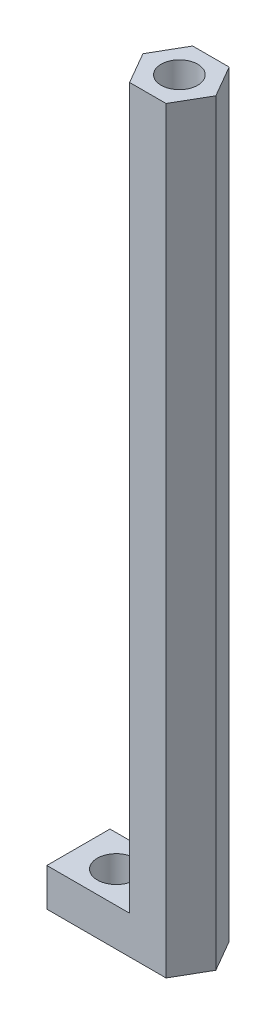
ISO-10303-21;
HEADER;
FILE_DESCRIPTION(('STEP AP214'),'2;1');
FILE_NAME('part.step','',(''),(''),'','','');
FILE_SCHEMA(('AUTOMOTIVE_DESIGN { 1 0 10303 214 1 1 1 1 }'));
ENDSEC;
DATA;
#1=APPLICATION_CONTEXT('core data for automotive mechanical design processes');
#2=APPLICATION_PROTOCOL_DEFINITION('international standard','automotive_design',2000,#1);
#3=PRODUCT_CONTEXT('',#1,'mechanical');
#4=PRODUCT('Part','Part','',(#3));
#5=PRODUCT_RELATED_PRODUCT_CATEGORY('part','',(#4));
#6=PRODUCT_DEFINITION_FORMATION('','',#4);
#7=PRODUCT_DEFINITION_CONTEXT('part definition',#1,'design');
#8=PRODUCT_DEFINITION('design','',#6,#7);
#9=PRODUCT_DEFINITION_SHAPE('','',#8);
#10=(LENGTH_UNIT() NAMED_UNIT(*) SI_UNIT(.MILLI.,.METRE.));
#11=(NAMED_UNIT(*) PLANE_ANGLE_UNIT() SI_UNIT($,.RADIAN.));
#12=(NAMED_UNIT(*) SI_UNIT($,.STERADIAN.) SOLID_ANGLE_UNIT());
#13=UNCERTAINTY_MEASURE_WITH_UNIT(LENGTH_MEASURE(1.E-05),#10,'distance_accuracy_value','');
#14=(GEOMETRIC_REPRESENTATION_CONTEXT(3) GLOBAL_UNCERTAINTY_ASSIGNED_CONTEXT((#13)) GLOBAL_UNIT_ASSIGNED_CONTEXT((#10,
#11,#12)) REPRESENTATION_CONTEXT('',''));
#15=CARTESIAN_POINT('',(0.,0.,0.));
#16=DIRECTION('',(0.,0.,1.));
#17=DIRECTION('',(1.,0.,0.));
#18=AXIS2_PLACEMENT_3D('',#15,#16,#17);
#19=CARTESIAN_POINT('',(3.55662432702594,60.,-2.5));
#20=DIRECTION('',(0.866025403784439,0.,0.5));
#21=DIRECTION('',(0.5,0.,-0.866025403784439));
#22=AXIS2_PLACEMENT_3D('',#19,#20,#21);
#23=PLANE('',#22);
#24=DIRECTION('',(0.,-1.,0.));
#25=VECTOR('',#24,1.);
#26=CARTESIAN_POINT('',(2.43649903883042,6.,-0.559886090002635));
#27=LINE('',#26,#25);
#28=CARTESIAN_POINT('',(2.43649903883042,7.00000000000002,-0.559886090002635));
#29=VERTEX_POINT('',#28);
#30=CARTESIAN_POINT('',(2.43649903883042,3.,-0.559886090002635));
#31=VERTEX_POINT('',#30);
#32=EDGE_CURVE('E111',#29,#31,#27,.T.);
#33=ORIENTED_EDGE('',*,*,#32,.F.);
#34=DIRECTION('',(-0.5,0.,0.866025403784439));
#35=VECTOR('',#34,1.);
#36=CARTESIAN_POINT('',(3.55662432702594,7.00000000000002,-2.5));
#37=LINE('',#36,#35);
#38=CARTESIAN_POINT('',(2.11324865405187,7.00000000000002,0.));
#39=VERTEX_POINT('',#38);
#40=EDGE_CURVE('E170',#29,#39,#37,.T.);
#41=ORIENTED_EDGE('',*,*,#40,.T.);
#42=DIRECTION('',(0.,-1.,0.));
#43=VECTOR('',#42,1.);
#44=CARTESIAN_POINT('',(2.11324865405187,60.,0.));
#45=LINE('',#44,#43);
#46=CARTESIAN_POINT('',(2.11324865405187,60.,0.));
#47=VERTEX_POINT('',#46);
#48=EDGE_CURVE('E176',#47,#39,#45,.T.);
#49=ORIENTED_EDGE('',*,*,#48,.F.);
#50=DIRECTION('',(-0.5,0.,0.866025403784439));
#51=VECTOR('',#50,1.);
#52=CARTESIAN_POINT('',(3.55662432702594,60.,-2.5));
#53=LINE('',#52,#51);
#54=CARTESIAN_POINT('',(3.55662432702594,60.,-2.5));
#55=VERTEX_POINT('',#54);
#56=EDGE_CURVE('E258',#55,#47,#53,.T.);
#57=ORIENTED_EDGE('',*,*,#56,.F.);
#58=DIRECTION('',(0.,-1.,0.));
#59=VECTOR('',#58,1.);
#60=CARTESIAN_POINT('',(3.55662432702594,60.,-2.5));
#61=LINE('',#60,#59);
#62=CARTESIAN_POINT('',(3.55662432702594,3.,-2.5));
#63=VERTEX_POINT('',#62);
#64=EDGE_CURVE('E181',#55,#63,#61,.T.);
#65=ORIENTED_EDGE('',*,*,#64,.T.);
#66=DIRECTION('',(0.5,0.,-0.866025403784439));
#67=VECTOR('',#66,1.);
#68=CARTESIAN_POINT('',(1.5849364905389,3.,0.915063509461097));
#69=LINE('',#68,#67);
#70=EDGE_CURVE('E132',#31,#63,#69,.T.);
#71=ORIENTED_EDGE('',*,*,#70,.F.);
#72=EDGE_LOOP('',(#33,#41,#49,#57,#65,#71));
#73=FACE_BOUND('',#72,.T.);
#74=ADVANCED_FACE('F33',(#73),#23,.F.);
#75=CARTESIAN_POINT('',(2.11324865405187,60.,0.));
#76=DIRECTION('',(0.866025403784439,0.,-0.5));
#77=DIRECTION('',(-0.5,0.,-0.866025403784439));
#78=AXIS2_PLACEMENT_3D('',#75,#76,#77);
#79=PLANE('',#78);
#80=ORIENTED_EDGE('',*,*,#48,.T.);
#81=DIRECTION('',(0.5,0.,0.866025403784439));
#82=VECTOR('',#81,1.);
#83=CARTESIAN_POINT('',(2.11324865405187,7.00000000000002,0.));
#84=LINE('',#83,#82);
#85=CARTESIAN_POINT('',(2.43649903883042,7.00000000000002,0.559886090002635));
#86=VERTEX_POINT('',#85);
#87=EDGE_CURVE('E125',#39,#86,#84,.T.);
#88=ORIENTED_EDGE('',*,*,#87,.T.);
#89=DIRECTION('',(0.,-1.,0.));
#90=VECTOR('',#89,1.);
#91=CARTESIAN_POINT('',(2.43649903883042,6.,0.559886090002635));
#92=LINE('',#91,#90);
#93=CARTESIAN_POINT('',(2.43649903883042,3.,0.559886090002635));
#94=VERTEX_POINT('',#93);
#95=EDGE_CURVE('E110',#94,#86,#92,.F.);
#96=ORIENTED_EDGE('',*,*,#95,.F.);
#97=DIRECTION('',(-0.5,0.,-0.866025403784439));
#98=VECTOR('',#97,1.);
#99=CARTESIAN_POINT('',(1.58493649053891,3.,-0.915063509461097));
#100=LINE('',#99,#98);
#101=CARTESIAN_POINT('',(3.55662432702594,3.,2.5));
#102=VERTEX_POINT('',#101);
#103=EDGE_CURVE('E122',#102,#94,#100,.T.);
#104=ORIENTED_EDGE('',*,*,#103,.F.);
#105=DIRECTION('',(0.,-1.,0.));
#106=VECTOR('',#105,1.);
#107=CARTESIAN_POINT('',(3.55662432702594,60.,2.5));
#108=LINE('',#107,#106);
#109=CARTESIAN_POINT('',(3.55662432702594,60.,2.5));
#110=VERTEX_POINT('',#109);
#111=EDGE_CURVE('E182',#110,#102,#108,.T.);
#112=ORIENTED_EDGE('',*,*,#111,.F.);
#113=DIRECTION('',(0.5,0.,0.866025403784439));
#114=VECTOR('',#113,1.);
#115=CARTESIAN_POINT('',(2.11324865405187,60.,0.));
#116=LINE('',#115,#114);
#117=EDGE_CURVE('E180',#47,#110,#116,.T.);
#118=ORIENTED_EDGE('',*,*,#117,.F.);
#119=EDGE_LOOP('',(#80,#88,#96,#104,#112,#118));
#120=FACE_BOUND('',#119,.T.);
#121=ADVANCED_FACE('F120',(#120),#79,.F.);
#122=CARTESIAN_POINT('',(0.,3.,0.));
#123=DIRECTION('',(0.,1.,0.));
#124=DIRECTION('',(0.,0.,1.));
#125=AXIS2_PLACEMENT_3D('',#122,#123,#124);
#126=PLANE('',#125);
#127=ORIENTED_EDGE('',*,*,#103,.T.);
#128=CARTESIAN_POINT('',(0.,3.,0.));
#129=DIRECTION('',(0.,1.,0.));
#130=DIRECTION('',(0.,0.,1.));
#131=AXIS2_PLACEMENT_3D('',#128,#129,#130);
#132=CIRCLE('',#131,2.5);
#133=EDGE_CURVE('E107',#94,#31,#132,.T.);
#134=ORIENTED_EDGE('',*,*,#133,.T.);
#135=ORIENTED_EDGE('',*,*,#70,.T.);
#136=DIRECTION('',(-1.,0.,0.));
#137=VECTOR('',#136,1.);
#138=CARTESIAN_POINT('',(0.,3.,-2.5));
#139=LINE('',#138,#137);
#140=CARTESIAN_POINT('',(-3.,3.,-2.5));
#141=VERTEX_POINT('',#140);
#142=EDGE_CURVE('E142',#63,#141,#139,.T.);
#143=ORIENTED_EDGE('',*,*,#142,.T.);
#144=DIRECTION('',(0.,0.,1.));
#145=VECTOR('',#144,1.);
#146=CARTESIAN_POINT('',(-3.,3.,0.));
#147=LINE('',#146,#145);
#148=CARTESIAN_POINT('',(-3.,3.,2.5));
#149=VERTEX_POINT('',#148);
#150=EDGE_CURVE('E145',#141,#149,#147,.T.);
#151=ORIENTED_EDGE('',*,*,#150,.T.);
#152=DIRECTION('',(1.,0.,0.));
#153=VECTOR('',#152,1.);
#154=CARTESIAN_POINT('',(0.,3.,2.5));
#155=LINE('',#154,#153);
#156=EDGE_CURVE('E131',#149,#102,#155,.T.);
#157=ORIENTED_EDGE('',*,*,#156,.T.);
#158=EDGE_LOOP('',(#127,#134,#135,#143,#151,#157));
#159=FACE_BOUND('',#158,.T.);
#160=CARTESIAN_POINT('',(0.,3.,0.));
#161=DIRECTION('',(0.,1.,0.));
#162=DIRECTION('',(0.,0.,1.));
#163=AXIS2_PLACEMENT_3D('',#160,#161,#162);
#164=CIRCLE('',#163,1.5);
#165=CARTESIAN_POINT('',(0.,3.,1.5));
#166=VERTEX_POINT('',#165);
#167=EDGE_CURVE('E147',#166,#166,#164,.T.);
#168=ORIENTED_EDGE('',*,*,#167,.F.);
#169=EDGE_LOOP('',(#168));
#170=FACE_BOUND('',#169,.T.);
#171=ADVANCED_FACE('F128',(#159,#170),#126,.T.);
#172=CARTESIAN_POINT('',(0.,3.,2.5));
#173=DIRECTION('',(0.,0.,-1.));
#174=DIRECTION('',(-1.,0.,0.));
#175=AXIS2_PLACEMENT_3D('',#172,#173,#174);
#176=PLANE('',#175);
#177=DIRECTION('',(1.,0.,0.));
#178=VECTOR('',#177,1.);
#179=CARTESIAN_POINT('',(0.,0.,2.5));
#180=LINE('',#179,#178);
#181=CARTESIAN_POINT('',(-3.,0.,2.5));
#182=VERTEX_POINT('',#181);
#183=CARTESIAN_POINT('',(6.44337567297407,0.,2.5));
#184=VERTEX_POINT('',#183);
#185=EDGE_CURVE('E135',#182,#184,#180,.T.);
#186=ORIENTED_EDGE('',*,*,#185,.T.);
#187=DIRECTION('',(0.,-1.,0.));
#188=VECTOR('',#187,1.);
#189=CARTESIAN_POINT('',(6.44337567297407,60.,2.5));
#190=LINE('',#189,#188);
#191=CARTESIAN_POINT('',(6.44337567297407,60.,2.5));
#192=VERTEX_POINT('',#191);
#193=EDGE_CURVE('E133',#192,#184,#190,.T.);
#194=ORIENTED_EDGE('',*,*,#193,.F.);
#195=DIRECTION('',(1.,0.,0.));
#196=VECTOR('',#195,1.);
#197=CARTESIAN_POINT('',(3.55662432702594,60.,2.5));
#198=LINE('',#197,#196);
#199=EDGE_CURVE('E246',#110,#192,#198,.T.);
#200=ORIENTED_EDGE('',*,*,#199,.F.);
#201=ORIENTED_EDGE('',*,*,#111,.T.);
#202=ORIENTED_EDGE('',*,*,#156,.F.);
#203=DIRECTION('',(0.,-1.,0.));
#204=VECTOR('',#203,1.);
#205=CARTESIAN_POINT('',(-3.,3.,2.5));
#206=LINE('',#205,#204);
#207=EDGE_CURVE('E150',#149,#182,#206,.T.);
#208=ORIENTED_EDGE('',*,*,#207,.T.);
#209=EDGE_LOOP('',(#186,#194,#200,#201,#202,#208));
#210=FACE_BOUND('',#209,.T.);
#211=ADVANCED_FACE('F212',(#210),#176,.F.);
#212=CARTESIAN_POINT('',(0.,3.,-2.5));
#213=DIRECTION('',(0.,0.,1.));
#214=DIRECTION('',(1.,0.,0.));
#215=AXIS2_PLACEMENT_3D('',#212,#213,#214);
#216=PLANE('',#215);
#217=DIRECTION('',(0.,-1.,0.));
#218=VECTOR('',#217,1.);
#219=CARTESIAN_POINT('',(6.44337567297406,60.,-2.5));
#220=LINE('',#219,#218);
#221=CARTESIAN_POINT('',(6.44337567297406,60.,-2.5));
#222=VERTEX_POINT('',#221);
#223=CARTESIAN_POINT('',(6.44337567297406,0.,-2.5));
#224=VERTEX_POINT('',#223);
#225=EDGE_CURVE('E264',#222,#224,#220,.T.);
#226=ORIENTED_EDGE('',*,*,#225,.T.);
#227=DIRECTION('',(-1.,0.,0.));
#228=VECTOR('',#227,1.);
#229=CARTESIAN_POINT('',(0.,0.,-2.5));
#230=LINE('',#229,#228);
#231=CARTESIAN_POINT('',(-3.,0.,-2.5));
#232=VERTEX_POINT('',#231);
#233=EDGE_CURVE('E153',#224,#232,#230,.T.);
#234=ORIENTED_EDGE('',*,*,#233,.T.);
#235=DIRECTION('',(0.,-1.,0.));
#236=VECTOR('',#235,1.);
#237=CARTESIAN_POINT('',(-3.,3.,-2.5));
#238=LINE('',#237,#236);
#239=EDGE_CURVE('E161',#141,#232,#238,.T.);
#240=ORIENTED_EDGE('',*,*,#239,.F.);
#241=ORIENTED_EDGE('',*,*,#142,.F.);
#242=ORIENTED_EDGE('',*,*,#64,.F.);
#243=DIRECTION('',(-1.,0.,0.));
#244=VECTOR('',#243,1.);
#245=CARTESIAN_POINT('',(6.44337567297406,60.,-2.5));
#246=LINE('',#245,#244);
#247=EDGE_CURVE('E256',#222,#55,#246,.T.);
#248=ORIENTED_EDGE('',*,*,#247,.F.);
#249=EDGE_LOOP('',(#226,#234,#240,#241,#242,#248));
#250=FACE_BOUND('',#249,.T.);
#251=ADVANCED_FACE('F223',(#250),#216,.F.);
#252=CARTESIAN_POINT('',(-3.,3.,0.));
#253=DIRECTION('',(1.,0.,0.));
#254=DIRECTION('',(0.,0.,-1.));
#255=AXIS2_PLACEMENT_3D('',#252,#253,#254);
#256=PLANE('',#255);
#257=DIRECTION('',(0.,0.,1.));
#258=VECTOR('',#257,1.);
#259=CARTESIAN_POINT('',(-3.,0.,0.));
#260=LINE('',#259,#258);
#261=EDGE_CURVE('E155',#232,#182,#260,.T.);
#262=ORIENTED_EDGE('',*,*,#261,.T.);
#263=ORIENTED_EDGE('',*,*,#207,.F.);
#264=ORIENTED_EDGE('',*,*,#150,.F.);
#265=ORIENTED_EDGE('',*,*,#239,.T.);
#266=EDGE_LOOP('',(#262,#263,#264,#265));
#267=FACE_BOUND('',#266,.T.);
#268=ADVANCED_FACE('F219',(#267),#256,.F.);
#269=CARTESIAN_POINT('',(0.,3.,0.));
#270=DIRECTION('',(0.,-1.,0.));
#271=DIRECTION('',(0.,0.,-1.));
#272=AXIS2_PLACEMENT_3D('',#269,#270,#271);
#273=CYLINDRICAL_SURFACE('',#272,1.5);
#274=ORIENTED_EDGE('',*,*,#167,.T.);
#275=EDGE_LOOP('',(#274));
#276=FACE_BOUND('',#275,.T.);
#277=CARTESIAN_POINT('',(0.,0.,0.));
#278=DIRECTION('',(0.,1.,0.));
#279=DIRECTION('',(0.,0.,1.));
#280=AXIS2_PLACEMENT_3D('',#277,#278,#279);
#281=CIRCLE('',#280,1.5);
#282=CARTESIAN_POINT('',(0.,0.,1.5));
#283=VERTEX_POINT('',#282);
#284=EDGE_CURVE('E143',#283,#283,#281,.T.);
#285=ORIENTED_EDGE('',*,*,#284,.F.);
#286=EDGE_LOOP('',(#285));
#287=FACE_BOUND('',#286,.T.);
#288=ADVANCED_FACE('F215',(#276,#287),#273,.F.);
#289=CARTESIAN_POINT('',(0.,0.,0.));
#290=DIRECTION('',(0.,1.,0.));
#291=DIRECTION('',(0.,0.,1.));
#292=AXIS2_PLACEMENT_3D('',#289,#290,#291);
#293=PLANE('',#292);
#294=ORIENTED_EDGE('',*,*,#233,.F.);
#295=DIRECTION('',(0.5,0.,0.866025403784439));
#296=VECTOR('',#295,1.);
#297=CARTESIAN_POINT('',(5.9150635094611,0.,-3.4150635094611));
#298=LINE('',#297,#296);
#299=CARTESIAN_POINT('',(7.88675134594813,0.,0.));
#300=VERTEX_POINT('',#299);
#301=EDGE_CURVE('E126',#224,#300,#298,.T.);
#302=ORIENTED_EDGE('',*,*,#301,.T.);
#303=DIRECTION('',(-0.5,0.,0.866025403784439));
#304=VECTOR('',#303,1.);
#305=CARTESIAN_POINT('',(5.9150635094611,0.,3.4150635094611));
#306=LINE('',#305,#304);
#307=EDGE_CURVE('E164',#300,#184,#306,.T.);
#308=ORIENTED_EDGE('',*,*,#307,.T.);
#309=ORIENTED_EDGE('',*,*,#185,.F.);
#310=ORIENTED_EDGE('',*,*,#261,.F.);
#311=EDGE_LOOP('',(#294,#302,#308,#309,#310));
#312=FACE_BOUND('',#311,.T.);
#313=ORIENTED_EDGE('',*,*,#284,.T.);
#314=EDGE_LOOP('',(#313));
#315=FACE_BOUND('',#314,.T.);
#316=ADVANCED_FACE('F208',(#312,#315),#293,.F.);
#317=CARTESIAN_POINT('',(6.44337567297407,60.,2.5));
#318=DIRECTION('',(-0.866025403784439,0.,-0.5));
#319=DIRECTION('',(-0.5,0.,0.866025403784439));
#320=AXIS2_PLACEMENT_3D('',#317,#318,#319);
#321=PLANE('',#320);
#322=ORIENTED_EDGE('',*,*,#193,.T.);
#323=ORIENTED_EDGE('',*,*,#307,.F.);
#324=DIRECTION('',(0.,-1.,0.));
#325=VECTOR('',#324,1.);
#326=CARTESIAN_POINT('',(7.88675134594813,60.,0.));
#327=LINE('',#326,#325);
#328=CARTESIAN_POINT('',(7.88675134594813,60.,0.));
#329=VERTEX_POINT('',#328);
#330=EDGE_CURVE('E137',#329,#300,#327,.T.);
#331=ORIENTED_EDGE('',*,*,#330,.F.);
#332=DIRECTION('',(0.5,0.,-0.866025403784439));
#333=VECTOR('',#332,1.);
#334=CARTESIAN_POINT('',(6.44337567297407,60.,2.5));
#335=LINE('',#334,#333);
#336=EDGE_CURVE('E242',#192,#329,#335,.T.);
#337=ORIENTED_EDGE('',*,*,#336,.F.);
#338=EDGE_LOOP('',(#322,#323,#331,#337));
#339=FACE_BOUND('',#338,.T.);
#340=ADVANCED_FACE('F204',(#339),#321,.F.);
#341=CARTESIAN_POINT('',(7.88675134594813,60.,0.));
#342=DIRECTION('',(-0.866025403784439,0.,0.5));
#343=DIRECTION('',(0.5,0.,0.866025403784439));
#344=AXIS2_PLACEMENT_3D('',#341,#342,#343);
#345=PLANE('',#344);
#346=ORIENTED_EDGE('',*,*,#330,.T.);
#347=ORIENTED_EDGE('',*,*,#301,.F.);
#348=ORIENTED_EDGE('',*,*,#225,.F.);
#349=DIRECTION('',(-0.5,0.,-0.866025403784439));
#350=VECTOR('',#349,1.);
#351=CARTESIAN_POINT('',(7.88675134594813,60.,0.));
#352=LINE('',#351,#350);
#353=EDGE_CURVE('E245',#329,#222,#352,.T.);
#354=ORIENTED_EDGE('',*,*,#353,.F.);
#355=EDGE_LOOP('',(#346,#347,#348,#354));
#356=FACE_BOUND('',#355,.T.);
#357=ADVANCED_FACE('F200',(#356),#345,.F.);
#358=CARTESIAN_POINT('',(0.,60.,0.));
#359=DIRECTION('',(0.,1.,0.));
#360=DIRECTION('',(0.,0.,1.));
#361=AXIS2_PLACEMENT_3D('',#358,#359,#360);
#362=PLANE('',#361);
#363=CARTESIAN_POINT('',(5.,60.,0.));
#364=DIRECTION('',(0.,1.,0.));
#365=DIRECTION('',(0.,0.,1.));
#366=AXIS2_PLACEMENT_3D('',#363,#364,#365);
#367=CIRCLE('',#366,1.45);
#368=CARTESIAN_POINT('',(5.,60.,1.45));
#369=VERTEX_POINT('',#368);
#370=EDGE_CURVE('E251',#369,#369,#367,.T.);
#371=ORIENTED_EDGE('',*,*,#370,.F.);
#372=EDGE_LOOP('',(#371));
#373=FACE_BOUND('',#372,.T.);
#374=ORIENTED_EDGE('',*,*,#199,.T.);
#375=ORIENTED_EDGE('',*,*,#336,.T.);
#376=ORIENTED_EDGE('',*,*,#353,.T.);
#377=ORIENTED_EDGE('',*,*,#247,.T.);
#378=ORIENTED_EDGE('',*,*,#56,.T.);
#379=ORIENTED_EDGE('',*,*,#117,.T.);
#380=EDGE_LOOP('',(#374,#375,#376,#377,#378,#379));
#381=FACE_BOUND('',#380,.T.);
#382=ADVANCED_FACE('F203',(#373,#381),#362,.T.);
#383=CARTESIAN_POINT('',(5.,50.,0.));
#384=DIRECTION('',(0.,1.,0.));
#385=DIRECTION('',(0.,0.,1.));
#386=AXIS2_PLACEMENT_3D('',#383,#384,#385);
#387=CYLINDRICAL_SURFACE('',#386,1.45);
#388=CARTESIAN_POINT('',(5.,50.,0.));
#389=DIRECTION('',(0.,1.,0.));
#390=DIRECTION('',(0.,0.,1.));
#391=AXIS2_PLACEMENT_3D('',#388,#389,#390);
#392=CIRCLE('',#391,1.45);
#393=CARTESIAN_POINT('',(5.,50.,1.45));
#394=VERTEX_POINT('',#393);
#395=EDGE_CURVE('E248',#394,#394,#392,.T.);
#396=ORIENTED_EDGE('',*,*,#395,.F.);
#397=EDGE_LOOP('',(#396));
#398=FACE_BOUND('',#397,.T.);
#399=ORIENTED_EDGE('',*,*,#370,.T.);
#400=EDGE_LOOP('',(#399));
#401=FACE_BOUND('',#400,.T.);
#402=ADVANCED_FACE('F275',(#398,#401),#387,.F.);
#403=CARTESIAN_POINT('',(5.,50.,0.));
#404=DIRECTION('',(0.,1.,0.));
#405=DIRECTION('',(0.,0.,1.));
#406=AXIS2_PLACEMENT_3D('',#403,#404,#405);
#407=PLANE('',#406);
#408=ORIENTED_EDGE('',*,*,#395,.T.);
#409=EDGE_LOOP('',(#408));
#410=FACE_BOUND('',#409,.T.);
#411=ADVANCED_FACE('F281',(#410),#407,.T.);
#412=CARTESIAN_POINT('',(0.,6.,0.));
#413=DIRECTION('',(0.,-1.,0.));
#414=DIRECTION('',(0.,0.,-1.));
#415=AXIS2_PLACEMENT_3D('',#412,#413,#414);
#416=CYLINDRICAL_SURFACE('',#415,2.5);
#417=ORIENTED_EDGE('',*,*,#32,.T.);
#418=ORIENTED_EDGE('',*,*,#133,.F.);
#419=ORIENTED_EDGE('',*,*,#95,.T.);
#420=CARTESIAN_POINT('',(0.,8.83012701892224,0.));
#421=DIRECTION('',(0.612372435695799,0.707106781186543,-0.353553390593276));
#422=DIRECTION('',(0.612372435695791,-0.707106781186552,-0.353553390593271));
#423=AXIS2_PLACEMENT_3D('',#420,#421,#422);
#424=ELLIPSE('',#423,3.53553390593276,2.5);
#425=CARTESIAN_POINT('',(2.5,6.66506350946111,0.));
#426=VERTEX_POINT('',#425);
#427=EDGE_CURVE('E43',#86,#426,#424,.T.);
#428=ORIENTED_EDGE('',*,*,#427,.T.);
#429=CARTESIAN_POINT('',(0.,8.83012701892224,0.));
#430=DIRECTION('',(0.612372435695798,0.707106781186543,0.353553390593276));
#431=DIRECTION('',(0.61237243569579,-0.707106781186552,0.353553390593272));
#432=AXIS2_PLACEMENT_3D('',#429,#430,#431);
#433=ELLIPSE('',#432,3.53553390593276,2.5);
#434=EDGE_CURVE('E11',#426,#29,#433,.T.);
#435=ORIENTED_EDGE('',*,*,#434,.T.);
#436=EDGE_LOOP('',(#417,#418,#419,#428,#435));
#437=FACE_BOUND('',#436,.T.);
#438=ADVANCED_FACE('F109',(#437),#416,.F.);
#439=CARTESIAN_POINT('',(3.55662432702594,7.00000000000002,-2.5));
#440=DIRECTION('',(0.612372435695798,0.707106781186543,0.353553390593276));
#441=DIRECTION('',(-0.5,0.,0.866025403784439));
#442=AXIS2_PLACEMENT_3D('',#439,#440,#441);
#443=PLANE('',#442);
#444=ORIENTED_EDGE('',*,*,#40,.F.);
#445=ORIENTED_EDGE('',*,*,#434,.F.);
#446=DIRECTION('',(-0.75592894601845,0.654653670707982,0.));
#447=VECTOR('',#446,1.);
#448=CARTESIAN_POINT('',(2.93803475289419,6.2857142857143,0.));
#449=LINE('',#448,#447);
#450=EDGE_CURVE('E37',#39,#426,#449,.F.);
#451=ORIENTED_EDGE('',*,*,#450,.F.);
#452=EDGE_LOOP('',(#444,#445,#451));
#453=FACE_BOUND('',#452,.T.);
#454=ADVANCED_FACE('F35',(#453),#443,.F.);
#455=CARTESIAN_POINT('',(2.11324865405187,7.00000000000002,0.));
#456=DIRECTION('',(0.612372435695799,0.707106781186543,-0.353553390593276));
#457=DIRECTION('',(0.5,0.,0.866025403784439));
#458=AXIS2_PLACEMENT_3D('',#455,#456,#457);
#459=PLANE('',#458);
#460=ORIENTED_EDGE('',*,*,#450,.T.);
#461=ORIENTED_EDGE('',*,*,#427,.F.);
#462=ORIENTED_EDGE('',*,*,#87,.F.);
#463=EDGE_LOOP('',(#460,#461,#462));
#464=FACE_BOUND('',#463,.T.);
#465=ADVANCED_FACE('F186',(#464),#459,.F.);
#466=CLOSED_SHELL('',(#74,#121,#171,#211,#251,#268,#288,#316,#340,#357,#382,#402,#411,#438,#454,#465));
#467=MANIFOLD_SOLID_BREP('B2',#466);
#468=ADVANCED_BREP_SHAPE_REPRESENTATION('',(#18,#467),#14);
#469=SHAPE_DEFINITION_REPRESENTATION(#9,#468);
ENDSEC;
END-ISO-10303-21;
